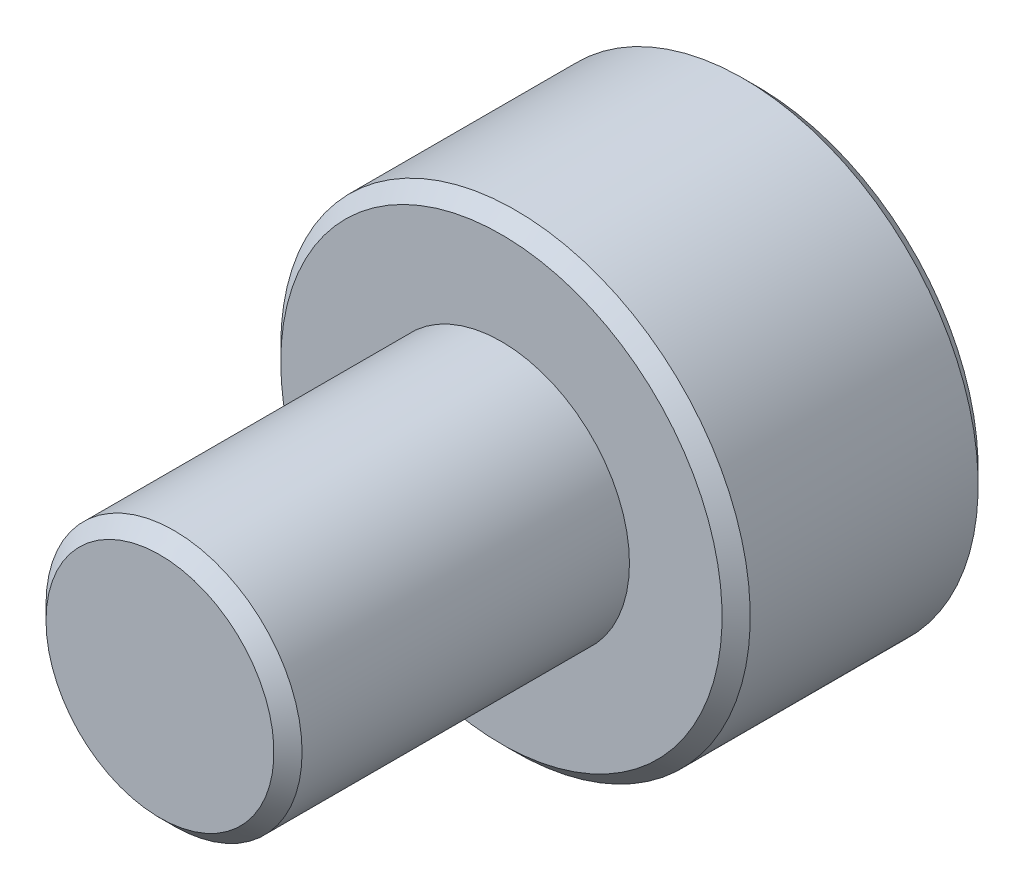
ISO-10303-21;
HEADER;
FILE_DESCRIPTION(('STEP AP214'),'2;1');
FILE_NAME('part.step','',(''),(''),'','','');
FILE_SCHEMA(('AUTOMOTIVE_DESIGN { 1 0 10303 214 1 1 1 1 }'));
ENDSEC;
DATA;
#1=APPLICATION_CONTEXT('core data for automotive mechanical design processes');
#2=APPLICATION_PROTOCOL_DEFINITION('international standard','automotive_design',2000,#1);
#3=PRODUCT_CONTEXT('',#1,'mechanical');
#4=PRODUCT('Part','Part','',(#3));
#5=PRODUCT_RELATED_PRODUCT_CATEGORY('part','',(#4));
#6=PRODUCT_DEFINITION_FORMATION('','',#4);
#7=PRODUCT_DEFINITION_CONTEXT('part definition',#1,'design');
#8=PRODUCT_DEFINITION('design','',#6,#7);
#9=PRODUCT_DEFINITION_SHAPE('','',#8);
#10=(LENGTH_UNIT() NAMED_UNIT(*) SI_UNIT(.MILLI.,.METRE.));
#11=(NAMED_UNIT(*) PLANE_ANGLE_UNIT() SI_UNIT($,.RADIAN.));
#12=(NAMED_UNIT(*) SI_UNIT($,.STERADIAN.) SOLID_ANGLE_UNIT());
#13=UNCERTAINTY_MEASURE_WITH_UNIT(LENGTH_MEASURE(1.E-05),#10,'distance_accuracy_value','');
#14=(GEOMETRIC_REPRESENTATION_CONTEXT(3) GLOBAL_UNCERTAINTY_ASSIGNED_CONTEXT((#13)) GLOBAL_UNIT_ASSIGNED_CONTEXT((#10,
#11,#12)) REPRESENTATION_CONTEXT('',''));
#15=CARTESIAN_POINT('',(0.,0.,0.));
#16=DIRECTION('',(0.,0.,1.));
#17=DIRECTION('',(1.,0.,0.));
#18=AXIS2_PLACEMENT_3D('',#15,#16,#17);
#19=CARTESIAN_POINT('',(0.,0.,-4.));
#20=DIRECTION('',(0.,0.,1.));
#21=DIRECTION('',(1.,0.,0.));
#22=AXIS2_PLACEMENT_3D('',#19,#20,#21);
#23=CYLINDRICAL_SURFACE('',#22,1.5);
#24=CARTESIAN_POINT('',(0.,0.,-0.165));
#25=DIRECTION('',(0.,0.,1.));
#26=DIRECTION('',(1.,0.,0.));
#27=AXIS2_PLACEMENT_3D('',#24,#25,#26);
#28=CIRCLE('',#27,1.5);
#29=CARTESIAN_POINT('',(-1.5,0.,-0.165));
#30=VERTEX_POINT('',#29);
#31=EDGE_CURVE('E170',#30,#30,#28,.F.);
#32=ORIENTED_EDGE('',*,*,#31,.T.);
#33=EDGE_LOOP('',(#32));
#34=FACE_BOUND('',#33,.T.);
#35=CARTESIAN_POINT('',(0.,0.,-4.));
#36=DIRECTION('',(0.,0.,-1.));
#37=DIRECTION('',(-1.,0.,0.));
#38=AXIS2_PLACEMENT_3D('',#35,#36,#37);
#39=CIRCLE('',#38,1.5);
#40=CARTESIAN_POINT('',(-1.5,0.,-4.));
#41=VERTEX_POINT('',#40);
#42=EDGE_CURVE('E111',#41,#41,#39,.F.);
#43=ORIENTED_EDGE('',*,*,#42,.T.);
#44=EDGE_LOOP('',(#43));
#45=FACE_BOUND('',#44,.T.);
#46=ADVANCED_FACE('F37',(#34,#45),#23,.T.);
#47=CARTESIAN_POINT('',(0.,0.,0.));
#48=DIRECTION('',(0.,0.,1.));
#49=DIRECTION('',(1.,0.,0.));
#50=AXIS2_PLACEMENT_3D('',#47,#48,#49);
#51=PLANE('',#50);
#52=CARTESIAN_POINT('',(0.,0.,0.));
#53=DIRECTION('',(0.,0.,1.));
#54=DIRECTION('',(1.,0.,0.));
#55=AXIS2_PLACEMENT_3D('',#52,#53,#54);
#56=CIRCLE('',#55,1.335);
#57=CARTESIAN_POINT('',(-1.335,0.,0.));
#58=VERTEX_POINT('',#57);
#59=EDGE_CURVE('E110',#58,#58,#56,.T.);
#60=ORIENTED_EDGE('',*,*,#59,.T.);
#61=EDGE_LOOP('',(#60));
#62=FACE_BOUND('',#61,.T.);
#63=ADVANCED_FACE('F198',(#62),#51,.T.);
#64=CARTESIAN_POINT('',(0.,0.,-7.));
#65=DIRECTION('',(0.,0.,1.));
#66=DIRECTION('',(1.,0.,0.));
#67=AXIS2_PLACEMENT_3D('',#64,#65,#66);
#68=CYLINDRICAL_SURFACE('',#67,2.75);
#69=CARTESIAN_POINT('',(0.,0.,-6.835));
#70=DIRECTION('',(0.,0.,-1.));
#71=DIRECTION('',(-1.,0.,0.));
#72=AXIS2_PLACEMENT_3D('',#69,#70,#71);
#73=CIRCLE('',#72,2.75);
#74=CARTESIAN_POINT('',(-2.75,0.,-6.835));
#75=VERTEX_POINT('',#74);
#76=EDGE_CURVE('E45',#75,#75,#73,.F.);
#77=ORIENTED_EDGE('',*,*,#76,.T.);
#78=EDGE_LOOP('',(#77));
#79=FACE_BOUND('',#78,.T.);
#80=CARTESIAN_POINT('',(0.,0.,-4.165));
#81=DIRECTION('',(0.,0.,-1.));
#82=DIRECTION('',(-1.,0.,0.));
#83=AXIS2_PLACEMENT_3D('',#80,#81,#82);
#84=CIRCLE('',#83,2.75);
#85=CARTESIAN_POINT('',(-2.75,0.,-4.165));
#86=VERTEX_POINT('',#85);
#87=EDGE_CURVE('E176',#86,#86,#84,.T.);
#88=ORIENTED_EDGE('',*,*,#87,.T.);
#89=EDGE_LOOP('',(#88));
#90=FACE_BOUND('',#89,.T.);
#91=ADVANCED_FACE('F181',(#79,#90),#68,.T.);
#92=CARTESIAN_POINT('',(0.,0.,-7.));
#93=DIRECTION('',(0.,0.,-1.));
#94=DIRECTION('',(-1.,0.,0.));
#95=AXIS2_PLACEMENT_3D('',#92,#93,#94);
#96=PLANE('',#95);
#97=CARTESIAN_POINT('',(0.,0.,-7.));
#98=DIRECTION('',(0.,0.,-1.));
#99=DIRECTION('',(-1.,0.,0.));
#100=AXIS2_PLACEMENT_3D('',#97,#98,#99);
#101=CIRCLE('',#100,2.585);
#102=CARTESIAN_POINT('',(-2.585,0.,-7.));
#103=VERTEX_POINT('',#102);
#104=EDGE_CURVE('E173',#103,#103,#101,.T.);
#105=ORIENTED_EDGE('',*,*,#104,.T.);
#106=EDGE_LOOP('',(#105));
#107=FACE_BOUND('',#106,.T.);
#108=CARTESIAN_POINT('',(0.,0.,-7.));
#109=DIRECTION('',(0.,0.,-1.));
#110=DIRECTION('',(-1.,0.,0.));
#111=AXIS2_PLACEMENT_3D('',#108,#109,#110);
#112=CIRCLE('',#111,1.44337567297406);
#113=CARTESIAN_POINT('',(-1.25,0.721687836487032,-7.));
#114=VERTEX_POINT('',#113);
#115=CARTESIAN_POINT('',(0.,1.44337567297407,-7.));
#116=VERTEX_POINT('',#115);
#117=EDGE_CURVE('E91',#114,#116,#112,.T.);
#118=ORIENTED_EDGE('',*,*,#117,.F.);
#119=CARTESIAN_POINT('',(-1.25,-0.721687836487032,-7.));
#120=VERTEX_POINT('',#119);
#121=EDGE_CURVE('E51',#120,#114,#112,.T.);
#122=ORIENTED_EDGE('',*,*,#121,.F.);
#123=CARTESIAN_POINT('',(0.,-1.44337567297406,-7.));
#124=VERTEX_POINT('',#123);
#125=EDGE_CURVE('E275',#124,#120,#112,.T.);
#126=ORIENTED_EDGE('',*,*,#125,.F.);
#127=CARTESIAN_POINT('',(1.25,-0.721687836487032,-7.));
#128=VERTEX_POINT('',#127);
#129=EDGE_CURVE('E58',#128,#124,#112,.T.);
#130=ORIENTED_EDGE('',*,*,#129,.F.);
#131=CARTESIAN_POINT('',(1.25,0.721687836487033,-7.));
#132=VERTEX_POINT('',#131);
#133=EDGE_CURVE('E132',#132,#128,#112,.T.);
#134=ORIENTED_EDGE('',*,*,#133,.F.);
#135=EDGE_CURVE('E100',#116,#132,#112,.T.);
#136=ORIENTED_EDGE('',*,*,#135,.F.);
#137=EDGE_LOOP('',(#118,#122,#126,#130,#134,#136));
#138=FACE_BOUND('',#137,.T.);
#139=ADVANCED_FACE('F131',(#107,#138),#96,.T.);
#140=CARTESIAN_POINT('',(0.,0.,-4.));
#141=DIRECTION('',(0.,0.,-1.));
#142=DIRECTION('',(-1.,0.,0.));
#143=AXIS2_PLACEMENT_3D('',#140,#141,#142);
#144=PLANE('',#143);
#145=CARTESIAN_POINT('',(0.,0.,-4.));
#146=DIRECTION('',(0.,0.,-1.));
#147=DIRECTION('',(-1.,0.,0.));
#148=AXIS2_PLACEMENT_3D('',#145,#146,#147);
#149=CIRCLE('',#148,2.585);
#150=CARTESIAN_POINT('',(-2.585,0.,-4.));
#151=VERTEX_POINT('',#150);
#152=EDGE_CURVE('E11',#151,#151,#149,.F.);
#153=ORIENTED_EDGE('',*,*,#152,.T.);
#154=EDGE_LOOP('',(#153));
#155=FACE_BOUND('',#154,.T.);
#156=ORIENTED_EDGE('',*,*,#42,.F.);
#157=EDGE_LOOP('',(#156));
#158=FACE_BOUND('',#157,.T.);
#159=ADVANCED_FACE('F191',(#155,#158),#144,.F.);
#160=CARTESIAN_POINT('',(0.,0.,-7.));
#161=DIRECTION('',(0.,0.,-1.));
#162=DIRECTION('',(-1.,0.,0.));
#163=AXIS2_PLACEMENT_3D('',#160,#161,#162);
#164=CONICAL_SURFACE('',#163,1.44337567297406,0.78539816339745);
#165=ORIENTED_EDGE('',*,*,#135,.T.);
#166=CARTESIAN_POINT('',(-0.000200000000000073,1.4434911430279,-7.00011548390914));
#167=CARTESIAN_POINT('',(0.0427751670715866,1.41867941875065,-6.9753216680551));
#168=CARTESIAN_POINT('',(0.086469004745948,1.39345276980743,-6.95198373441868));
#169=CARTESIAN_POINT('',(0.175565930841942,1.34201263554194,-6.90925200408454));
#170=CARTESIAN_POINT('',(0.220977498357064,1.31579425481276,-6.88988199236041));
#171=CARTESIAN_POINT('',(0.31254782093526,1.26292610442246,-6.85670048341348));
#172=CARTESIAN_POINT('',(0.358683240175886,1.23628980770471,-6.84280555905266));
#173=CARTESIAN_POINT('',(0.451970080407593,1.18243062538508,-6.82139728216064));
#174=CARTESIAN_POINT('',(0.49911864913638,1.15520938653761,-6.81386794156679));
#175=CARTESIAN_POINT('',(0.580373556887253,1.10829684367467,-6.8070744980507));
#176=CARTESIAN_POINT('',(0.614374876627942,1.08866617256958,-6.80606855910435));
#177=CARTESIAN_POINT('',(0.682317764432478,1.04943932800611,-6.80776141491132));
#178=CARTESIAN_POINT('',(0.716259317655658,1.02984316311599,-6.81046102721554));
#179=CARTESIAN_POINT('',(0.7838148564575,0.990839954603499,-6.81940893031638));
#180=CARTESIAN_POINT('',(0.817428507286775,0.971433104248771,-6.82566052589971));
#181=CARTESIAN_POINT('',(0.884094638217814,0.932943395609905,-6.84137568141391));
#182=CARTESIAN_POINT('',(0.917146871030296,0.9138606800983,-6.85084062008746));
#183=CARTESIAN_POINT('',(1.00179969160026,0.864986351354567,-6.87893139068759));
#184=CARTESIAN_POINT('',(1.05286649242964,0.835502920149076,-6.8996701574522));
#185=CARTESIAN_POINT('',(1.15300085411326,0.777690319475908,-6.94638713467148));
#186=CARTESIAN_POINT('',(1.20207431157827,0.749357745598416,-6.97234829594677));
#187=CARTESIAN_POINT('',(1.2502,0.721572366433194,-7.00011548390914));
#188=B_SPLINE_CURVE_WITH_KNOTS('',3,(#166,#167,#168,#169,#170,#171,#172,#173,#174,#175,#176,
#177,#178,#179,#180,#181,#182,#183,#184,#185,#186,#187),.UNSPECIFIED.,.F.,.F.,(4,2,2,2,2,2,2,2,
2,2,4),(0.,0.166533409618304,0.334037607289762,0.498880396489699,0.663307919240275,
0.780963963458828,0.898645970148454,1.01643764860773,1.1342799317155,1.32148652032141,
1.50809158792574),.UNSPECIFIED.);
#189=EDGE_CURVE('E105',#116,#132,#188,.T.);
#190=ORIENTED_EDGE('',*,*,#189,.F.);
#191=EDGE_LOOP('',(#165,#190));
#192=FACE_BOUND('',#191,.T.);
#193=ADVANCED_FACE('F106',(#192),#164,.F.);
#194=ORIENTED_EDGE('',*,*,#133,.T.);
#195=CARTESIAN_POINT('',(1.25,-1.43934010808077,-7.46298209689233));
#196=CARTESIAN_POINT('',(1.25,-1.40429313005659,-7.43652492263289));
#197=CARTESIAN_POINT('',(1.25,-1.36905087135599,-7.41032716035428));
#198=CARTESIAN_POINT('',(1.25,-1.29809650706311,-7.35855757183958));
#199=CARTESIAN_POINT('',(1.25,-1.26238428576495,-7.33298590435629));
#200=CARTESIAN_POINT('',(1.25,-1.15390111792708,-7.25700599368946));
#201=CARTESIAN_POINT('',(1.25,-1.08031646726264,-7.20774028618957));
#202=CARTESIAN_POINT('',(1.25,-0.926012322755096,-7.11102583026313));
#203=CARTESIAN_POINT('',(1.25,-0.845125318656148,-7.0638412989418));
#204=CARTESIAN_POINT('',(1.25,-0.679311174076603,-6.97753073439041));
#205=CARTESIAN_POINT('',(1.25,-0.594398891026688,-6.9383775346269));
#206=CARTESIAN_POINT('',(1.25,-0.46694481246074,-6.89047722368829));
#207=CARTESIAN_POINT('',(1.25,-0.426289985812822,-6.87672948978634));
#208=CARTESIAN_POINT('',(1.25,-0.343998850091267,-6.85249792745054));
#209=CARTESIAN_POINT('',(1.25,-0.302362473614962,-6.84201432386977));
#210=CARTESIAN_POINT('',(1.25,-0.219052696285665,-6.8250301617483));
#211=CARTESIAN_POINT('',(1.25,-0.1773934284745,-6.81846136047137));
#212=CARTESIAN_POINT('',(1.25,-0.0936293693401918,-6.80943505345776));
#213=CARTESIAN_POINT('',(1.25,-0.0515246558543955,-6.80697684099727));
#214=CARTESIAN_POINT('',(1.25,0.0311890576306321,-6.80635406201328));
#215=CARTESIAN_POINT('',(1.25,0.0717969625499308,-6.80803711684625));
#216=CARTESIAN_POINT('',(1.25,0.152668636885198,-6.81526827059791));
#217=CARTESIAN_POINT('',(1.25,0.192932338835358,-6.82081711041311));
#218=CARTESIAN_POINT('',(1.25,0.273499879165295,-6.83557103646495));
#219=CARTESIAN_POINT('',(1.25,0.313792180618511,-6.8448381759641));
#220=CARTESIAN_POINT('',(1.25,0.393496413911457,-6.86653617845735));
#221=CARTESIAN_POINT('',(1.25,0.432908419115059,-6.87896677673065));
#222=CARTESIAN_POINT('',(1.25,0.556992735862299,-6.92277935293144));
#223=CARTESIAN_POINT('',(1.25,0.639898924666086,-6.95915107287596));
#224=CARTESIAN_POINT('',(1.25,0.801816555499702,-7.04001916217834));
#225=CARTESIAN_POINT('',(1.25,0.880812666325046,-7.08454472091199));
#226=CARTESIAN_POINT('',(1.25,1.0317856127975,-7.17640487666663));
#227=CARTESIAN_POINT('',(1.25,1.10391618485086,-7.22348993391625));
#228=CARTESIAN_POINT('',(1.25,1.21018606043311,-7.29627856159854));
#229=CARTESIAN_POINT('',(1.25,1.2451506996938,-7.32079808539336));
#230=CARTESIAN_POINT('',(1.25,1.31460220852737,-7.37048563676568));
#231=CARTESIAN_POINT('',(1.25,1.34908920596618,-7.39565348541552));
#232=CARTESIAN_POINT('',(1.25,1.38337731682912,-7.42109014884121));
#233=B_SPLINE_CURVE_WITH_KNOTS('',3,(#195,#196,#197,#198,#199,#200,#201,#202,#203,#204,#205,
#206,#207,#208,#209,#210,#211,#212,#213,#214,#215,#216,#217,#218,#219,#220,#221,#222,#223,#224,
#225,#226,#227,#228,#229,#230,#231,#232),.UNSPECIFIED.,.F.,.F.,(4,2,2,2,2,2,2,2,2,2,2,2,2,2,2,2,
2,2,4),(0.,0.131732960381448,0.263498984161644,0.529042014455825,0.809741926134618,
1.08947609717225,1.21811634272577,1.34676544783901,1.47310084517844,1.59941451973785,
1.7211504216785,1.84290966131735,1.96679153905342,2.09066305366039,2.36146692896009,
2.63325989198491,2.89154668212279,3.01965734507713,3.14773302245628),.UNSPECIFIED.);
#234=EDGE_CURVE('E99',#132,#128,#233,.F.);
#235=ORIENTED_EDGE('',*,*,#234,.F.);
#236=EDGE_LOOP('',(#194,#235));
#237=FACE_BOUND('',#236,.T.);
#238=ADVANCED_FACE('F281',(#237),#164,.F.);
#239=ORIENTED_EDGE('',*,*,#129,.T.);
#240=CARTESIAN_POINT('',(1.2502,-0.721572366433195,-7.00011548390914));
#241=CARTESIAN_POINT('',(1.20722483292841,-0.746384090710445,-6.9753216680551));
#242=CARTESIAN_POINT('',(1.16353099525405,-0.771610739653665,-6.95198373441868));
#243=CARTESIAN_POINT('',(1.07443406915806,-0.823050873919155,-6.90925200408454));
#244=CARTESIAN_POINT('',(1.02902250164294,-0.849269254648334,-6.88988199236041));
#245=CARTESIAN_POINT('',(0.93745217906474,-0.902137405038636,-6.85670048341348));
#246=CARTESIAN_POINT('',(0.891316759824114,-0.928773701756388,-6.84280555905266));
#247=CARTESIAN_POINT('',(0.798029919592407,-0.982632884076013,-6.82139728216064));
#248=CARTESIAN_POINT('',(0.75088135086362,-1.00985412292348,-6.81386794156679));
#249=CARTESIAN_POINT('',(0.669626443112747,-1.05676666578643,-6.8070744980507));
#250=CARTESIAN_POINT('',(0.635625123372059,-1.07639733689152,-6.80606855910435));
#251=CARTESIAN_POINT('',(0.567682235567522,-1.11562418145499,-6.80776141491132));
#252=CARTESIAN_POINT('',(0.533740682344342,-1.1352203463451,-6.81046102721554));
#253=CARTESIAN_POINT('',(0.4661851435425,-1.1742235548576,-6.81940893031638));
#254=CARTESIAN_POINT('',(0.432571492713225,-1.19363040521233,-6.82566052589971));
#255=CARTESIAN_POINT('',(0.365905361782187,-1.23212011385119,-6.84137568141391));
#256=CARTESIAN_POINT('',(0.332853128969704,-1.2512028293628,-6.85084062008746));
#257=CARTESIAN_POINT('',(0.248200308399735,-1.30007715810653,-6.87893139068759));
#258=CARTESIAN_POINT('',(0.197133507570361,-1.32956058931202,-6.8996701574522));
#259=CARTESIAN_POINT('',(0.0969991458867447,-1.38737318998519,-6.94638713467148));
#260=CARTESIAN_POINT('',(0.0479256884217303,-1.41570576386268,-6.97234829594677));
#261=CARTESIAN_POINT('',(-0.000199999999999965,-1.4434911430279,-7.00011548390914));
#262=B_SPLINE_CURVE_WITH_KNOTS('',3,(#240,#241,#242,#243,#244,#245,#246,#247,#248,#249,#250,
#251,#252,#253,#254,#255,#256,#257,#258,#259,#260,#261),.UNSPECIFIED.,.F.,.F.,(4,2,2,2,2,2,2,2,
2,2,4),(0.,0.166533409618304,0.334037607289762,0.498880396489699,0.663307919240275,
0.780963963458827,0.898645970148453,1.01643764860773,1.1342799317155,1.32148652032141,
1.50809158792574),.UNSPECIFIED.);
#263=EDGE_CURVE('E141',#128,#124,#262,.T.);
#264=ORIENTED_EDGE('',*,*,#263,.F.);
#265=EDGE_LOOP('',(#239,#264));
#266=FACE_BOUND('',#265,.T.);
#267=ADVANCED_FACE('F279',(#266),#164,.F.);
#268=ORIENTED_EDGE('',*,*,#125,.T.);
#269=CARTESIAN_POINT('',(0.000200000000000079,-1.4434911430279,-7.00011548390914));
#270=CARTESIAN_POINT('',(-0.0427751670715866,-1.41867941875065,-6.9753216680551));
#271=CARTESIAN_POINT('',(-0.086469004745948,-1.39345276980743,-6.95198373441868));
#272=CARTESIAN_POINT('',(-0.175565930841942,-1.34201263554194,-6.90925200408454));
#273=CARTESIAN_POINT('',(-0.220977498357064,-1.31579425481276,-6.88988199236041));
#274=CARTESIAN_POINT('',(-0.31254782093526,-1.26292610442246,-6.85670048341348));
#275=CARTESIAN_POINT('',(-0.358683240175886,-1.23628980770471,-6.84280555905266));
#276=CARTESIAN_POINT('',(-0.451970080407592,-1.18243062538508,-6.82139728216064));
#277=CARTESIAN_POINT('',(-0.49911864913638,-1.15520938653761,-6.81386794156679));
#278=CARTESIAN_POINT('',(-0.580373556887252,-1.10829684367467,-6.8070744980507));
#279=CARTESIAN_POINT('',(-0.614374876627941,-1.08866617256958,-6.80606855910435));
#280=CARTESIAN_POINT('',(-0.682317764432477,-1.04943932800611,-6.80776141491132));
#281=CARTESIAN_POINT('',(-0.716259317655657,-1.02984316311599,-6.81046102721554));
#282=CARTESIAN_POINT('',(-0.783814856457499,-0.9908399546035,-6.81940893031638));
#283=CARTESIAN_POINT('',(-0.817428507286775,-0.971433104248772,-6.82566052589971));
#284=CARTESIAN_POINT('',(-0.884094638217813,-0.932943395609906,-6.8413756814139));
#285=CARTESIAN_POINT('',(-0.917146871030295,-0.913860680098301,-6.85084062008746));
#286=CARTESIAN_POINT('',(-1.00179969160026,-0.864986351354568,-6.87893139068759));
#287=CARTESIAN_POINT('',(-1.05286649242964,-0.835502920149076,-6.8996701574522));
#288=CARTESIAN_POINT('',(-1.15300085411326,-0.777690319475909,-6.94638713467148));
#289=CARTESIAN_POINT('',(-1.20207431157827,-0.749357745598417,-6.97234829594677));
#290=CARTESIAN_POINT('',(-1.2502,-0.721572366433195,-7.00011548390914));
#291=B_SPLINE_CURVE_WITH_KNOTS('',3,(#269,#270,#271,#272,#273,#274,#275,#276,#277,#278,#279,
#280,#281,#282,#283,#284,#285,#286,#287,#288,#289,#290),.UNSPECIFIED.,.F.,.F.,(4,2,2,2,2,2,2,2,
2,2,4),(0.,0.166533409618304,0.334037607289762,0.498880396489698,0.663307919240274,
0.780963963458827,0.898645970148453,1.01643764860773,1.13427993171549,1.32148652032141,
1.50809158792574),.UNSPECIFIED.);
#292=EDGE_CURVE('E235',#124,#120,#291,.T.);
#293=ORIENTED_EDGE('',*,*,#292,.F.);
#294=EDGE_LOOP('',(#268,#293));
#295=FACE_BOUND('',#294,.T.);
#296=ADVANCED_FACE('F276',(#295),#164,.F.);
#297=ORIENTED_EDGE('',*,*,#121,.T.);
#298=CARTESIAN_POINT('',(-1.25,-1.43934010829019,-7.46298209705044));
#299=CARTESIAN_POINT('',(-1.25,-1.40429313026013,-7.43652492278491));
#300=CARTESIAN_POINT('',(-1.25,-1.36905087155364,-7.41032716050022));
#301=CARTESIAN_POINT('',(-1.25,-1.29809650724891,-7.3585575719734));
#302=CARTESIAN_POINT('',(-1.25,-1.2623842859448,-7.33298590448407));
#303=CARTESIAN_POINT('',(-1.25,-1.1539011180887,-7.25700599379899));
#304=CARTESIAN_POINT('',(-1.25,-1.08031646741187,-7.20774028628697));
#305=CARTESIAN_POINT('',(-1.25,-0.926012322877302,-7.11102583033562));
#306=CARTESIAN_POINT('',(-1.25,-0.845125318763648,-7.06384129900157));
#307=CARTESIAN_POINT('',(-1.25,-0.679311174153443,-6.97753073442662));
#308=CARTESIAN_POINT('',(-1.25,-0.594398891087583,-6.93837753465223));
#309=CARTESIAN_POINT('',(-1.25,-0.466944812509639,-6.89047722370555));
#310=CARTESIAN_POINT('',(-1.25,-0.426289985866744,-6.87672948980391));
#311=CARTESIAN_POINT('',(-1.25,-0.343998850155403,-6.85249792746773));
#312=CARTESIAN_POINT('',(-1.25,-0.302362473684286,-6.84201432388626));
#313=CARTESIAN_POINT('',(-1.25,-0.219052696365195,-6.8250301617622));
#314=CARTESIAN_POINT('',(-1.25,-0.177393428559044,-6.81846136048343));
#315=CARTESIAN_POINT('',(-1.25,-0.0936293694345982,-6.80943505346499));
#316=CARTESIAN_POINT('',(-1.25,-0.051524655953649,-6.80697684100152));
#317=CARTESIAN_POINT('',(-1.25,0.0311890575224387,-6.80635406201073));
#318=CARTESIAN_POINT('',(-1.25,0.071796962437632,-6.80803711683992));
#319=CARTESIAN_POINT('',(-1.25,0.152668636765093,-6.81526827058346));
#320=CARTESIAN_POINT('',(-1.25,0.192932338711554,-6.8208171103943));
#321=CARTESIAN_POINT('',(-1.25,0.273499879034189,-6.83557103643701));
#322=CARTESIAN_POINT('',(-1.25,0.313792180483814,-6.84483817593136));
#323=CARTESIAN_POINT('',(-1.25,0.393496413769926,-6.86653617841489));
#324=CARTESIAN_POINT('',(-1.25,0.432908418970283,-6.87896677668328));
#325=CARTESIAN_POINT('',(-1.25,0.556992735685998,-6.92277935286094));
#326=CARTESIAN_POINT('',(-1.25,0.639898924463084,-6.95915107278417));
#327=CARTESIAN_POINT('',(-1.25,0.801816555245349,-7.04001916204164));
#328=CARTESIAN_POINT('',(-1.25,0.880812666046053,-7.08454472075164));
#329=CARTESIAN_POINT('',(-1.25,1.03178561247421,-7.17640487646102));
#330=CARTESIAN_POINT('',(-1.25,1.10391618450775,-7.22348993368924));
#331=CARTESIAN_POINT('',(-1.25,1.2101860600607,-7.29627856133952));
#332=CARTESIAN_POINT('',(-1.25,1.24515069931176,-7.32079808512376));
#333=CARTESIAN_POINT('',(-1.25,1.31460220812614,-7.37048563647493));
#334=CARTESIAN_POINT('',(-1.25,1.3490892055554,-7.3956534851142));
#335=CARTESIAN_POINT('',(-1.25,1.38337731640879,-7.42109014852934));
#336=B_SPLINE_CURVE_WITH_KNOTS('',3,(#298,#299,#300,#301,#302,#303,#304,#305,#306,#307,#308,
#309,#310,#311,#312,#313,#314,#315,#316,#317,#318,#319,#320,#321,#322,#323,#324,#325,#326,#327,
#328,#329,#330,#331,#332,#333,#334,#335),.UNSPECIFIED.,.F.,.F.,(4,2,2,2,2,2,2,2,2,2,2,2,2,2,2,2,
2,2,4),(0.,0.131732960406523,0.263498984211801,0.529042014557082,0.809741926293179,
1.08947609738757,1.21811634292656,1.34676544802529,1.47310084535082,1.59941451989631,
1.72115042182424,1.84290966145034,1.96679153917269,2.09066305376595,2.36146692896707,
2.63325989189267,2.89154668194565,3.01965734485811,3.1477330221954),.UNSPECIFIED.);
#337=EDGE_CURVE('E121',#120,#114,#336,.T.);
#338=ORIENTED_EDGE('',*,*,#337,.F.);
#339=EDGE_LOOP('',(#297,#338));
#340=FACE_BOUND('',#339,.T.);
#341=ADVANCED_FACE('F272',(#340),#164,.F.);
#342=ORIENTED_EDGE('',*,*,#117,.T.);
#343=CARTESIAN_POINT('',(-1.2502,0.721572366433195,-7.00011548390914));
#344=CARTESIAN_POINT('',(-1.20722483292841,0.746384090710444,-6.9753216680551));
#345=CARTESIAN_POINT('',(-1.16353099525405,0.771610739653664,-6.95198373441868));
#346=CARTESIAN_POINT('',(-1.07443406915806,0.823050873919155,-6.90925200408454));
#347=CARTESIAN_POINT('',(-1.02902250164294,0.849269254648334,-6.88988199236042));
#348=CARTESIAN_POINT('',(-0.93745217906474,0.902137405038636,-6.85670048341348));
#349=CARTESIAN_POINT('',(-0.891316759824115,0.928773701756388,-6.84280555905266));
#350=CARTESIAN_POINT('',(-0.798029919592408,0.982632884076013,-6.82139728216064));
#351=CARTESIAN_POINT('',(-0.75088135086362,1.00985412292348,-6.81386794156679));
#352=CARTESIAN_POINT('',(-0.669626443112747,1.05676666578643,-6.8070744980507));
#353=CARTESIAN_POINT('',(-0.635625123372059,1.07639733689152,-6.80606855910435));
#354=CARTESIAN_POINT('',(-0.567682235567522,1.11562418145499,-6.80776141491132));
#355=CARTESIAN_POINT('',(-0.533740682344342,1.1352203463451,-6.81046102721554));
#356=CARTESIAN_POINT('',(-0.4661851435425,1.1742235548576,-6.81940893031638));
#357=CARTESIAN_POINT('',(-0.432571492713225,1.19363040521233,-6.82566052589971));
#358=CARTESIAN_POINT('',(-0.365905361782186,1.23212011385119,-6.84137568141391));
#359=CARTESIAN_POINT('',(-0.332853128969704,1.2512028293628,-6.85084062008746));
#360=CARTESIAN_POINT('',(-0.248200308399735,1.30007715810653,-6.87893139068759));
#361=CARTESIAN_POINT('',(-0.197133507570361,1.32956058931202,-6.8996701574522));
#362=CARTESIAN_POINT('',(-0.0969991458867449,1.38737318998519,-6.94638713467148));
#363=CARTESIAN_POINT('',(-0.0479256884217304,1.41570576386268,-6.97234829594677));
#364=CARTESIAN_POINT('',(0.000200000000000037,1.4434911430279,-7.00011548390914));
#365=B_SPLINE_CURVE_WITH_KNOTS('',3,(#343,#344,#345,#346,#347,#348,#349,#350,#351,#352,#353,
#354,#355,#356,#357,#358,#359,#360,#361,#362,#363,#364),.UNSPECIFIED.,.F.,.F.,(4,2,2,2,2,2,2,2,
2,2,4),(0.,0.166533409618304,0.334037607289762,0.498880396489699,0.663307919240275,
0.780963963458828,0.898645970148454,1.01643764860773,1.1342799317155,1.32148652032141,
1.50809158792574),.UNSPECIFIED.);
#366=EDGE_CURVE('E95',#114,#116,#365,.T.);
#367=ORIENTED_EDGE('',*,*,#366,.F.);
#368=EDGE_LOOP('',(#342,#367));
#369=FACE_BOUND('',#368,.T.);
#370=ADVANCED_FACE('F93',(#369),#164,.F.);
#371=CARTESIAN_POINT('',(1.25,2.1650635094611,-5.125));
#372=DIRECTION('',(0.,0.,-1.));
#373=DIRECTION('',(-1.,0.,0.));
#374=AXIS2_PLACEMENT_3D('',#371,#372,#373);
#375=PLANE('',#374);
#376=DIRECTION('',(0.866025403784439,0.5,0.));
#377=VECTOR('',#376,1.);
#378=CARTESIAN_POINT('',(-1.25,0.721687836487032,-5.125));
#379=LINE('',#378,#377);
#380=CARTESIAN_POINT('',(-1.25,0.721687836487032,-5.125));
#381=VERTEX_POINT('',#380);
#382=CARTESIAN_POINT('',(0.,1.44337567297406,-5.125));
#383=VERTEX_POINT('',#382);
#384=EDGE_CURVE('E120',#381,#383,#379,.T.);
#385=ORIENTED_EDGE('',*,*,#384,.T.);
#386=DIRECTION('',(0.866025403784439,-0.5,0.));
#387=VECTOR('',#386,1.);
#388=CARTESIAN_POINT('',(0.,1.44337567297406,-5.125));
#389=LINE('',#388,#387);
#390=CARTESIAN_POINT('',(1.25,0.721687836487032,-5.125));
#391=VERTEX_POINT('',#390);
#392=EDGE_CURVE('E125',#383,#391,#389,.T.);
#393=ORIENTED_EDGE('',*,*,#392,.T.);
#394=DIRECTION('',(0.,-1.,0.));
#395=VECTOR('',#394,1.);
#396=CARTESIAN_POINT('',(1.25,0.721687836487032,-5.125));
#397=LINE('',#396,#395);
#398=CARTESIAN_POINT('',(1.25,-0.721687836487033,-5.125));
#399=VERTEX_POINT('',#398);
#400=EDGE_CURVE('E245',#391,#399,#397,.T.);
#401=ORIENTED_EDGE('',*,*,#400,.T.);
#402=DIRECTION('',(-0.866025403784439,-0.5,0.));
#403=VECTOR('',#402,1.);
#404=CARTESIAN_POINT('',(1.25,-0.721687836487033,-5.125));
#405=LINE('',#404,#403);
#406=CARTESIAN_POINT('',(0.,-1.44337567297406,-5.125));
#407=VERTEX_POINT('',#406);
#408=EDGE_CURVE('E248',#399,#407,#405,.T.);
#409=ORIENTED_EDGE('',*,*,#408,.T.);
#410=DIRECTION('',(-0.866025403784439,0.5,0.));
#411=VECTOR('',#410,1.);
#412=CARTESIAN_POINT('',(0.,-1.44337567297406,-5.125));
#413=LINE('',#412,#411);
#414=CARTESIAN_POINT('',(-1.25,-0.721687836487032,-5.125));
#415=VERTEX_POINT('',#414);
#416=EDGE_CURVE('E251',#407,#415,#413,.T.);
#417=ORIENTED_EDGE('',*,*,#416,.T.);
#418=DIRECTION('',(0.,1.,0.));
#419=VECTOR('',#418,1.);
#420=CARTESIAN_POINT('',(-1.25,-0.721687836487032,-5.125));
#421=LINE('',#420,#419);
#422=EDGE_CURVE('E128',#415,#381,#421,.T.);
#423=ORIENTED_EDGE('',*,*,#422,.T.);
#424=EDGE_LOOP('',(#385,#393,#401,#409,#417,#423));
#425=FACE_BOUND('',#424,.T.);
#426=ADVANCED_FACE('F160',(#425),#375,.T.);
#427=CARTESIAN_POINT('',(0.,1.44337567297406,-5.125));
#428=DIRECTION('',(0.5,0.866025403784439,0.));
#429=DIRECTION('',(-0.866025403784439,0.5,0.));
#430=AXIS2_PLACEMENT_3D('',#427,#428,#429);
#431=PLANE('',#430);
#432=DIRECTION('',(0.,0.,-1.));
#433=VECTOR('',#432,1.);
#434=CARTESIAN_POINT('',(0.,1.44337567297406,-5.125));
#435=LINE('',#434,#433);
#436=EDGE_CURVE('E117',#383,#116,#435,.T.);
#437=ORIENTED_EDGE('',*,*,#436,.T.);
#438=ORIENTED_EDGE('',*,*,#189,.T.);
#439=DIRECTION('',(0.,0.,-1.));
#440=VECTOR('',#439,1.);
#441=CARTESIAN_POINT('',(1.25,0.721687836487032,-5.125));
#442=LINE('',#441,#440);
#443=EDGE_CURVE('E127',#391,#132,#442,.T.);
#444=ORIENTED_EDGE('',*,*,#443,.F.);
#445=ORIENTED_EDGE('',*,*,#392,.F.);
#446=EDGE_LOOP('',(#437,#438,#444,#445));
#447=FACE_BOUND('',#446,.T.);
#448=ADVANCED_FACE('F123',(#447),#431,.F.);
#449=CARTESIAN_POINT('',(1.25,0.721687836487032,-5.125));
#450=DIRECTION('',(1.,0.,0.));
#451=DIRECTION('',(0.,0.,-1.));
#452=AXIS2_PLACEMENT_3D('',#449,#450,#451);
#453=PLANE('',#452);
#454=ORIENTED_EDGE('',*,*,#443,.T.);
#455=ORIENTED_EDGE('',*,*,#234,.T.);
#456=DIRECTION('',(0.,0.,-1.));
#457=VECTOR('',#456,1.);
#458=CARTESIAN_POINT('',(1.25,-0.721687836487033,-5.125));
#459=LINE('',#458,#457);
#460=EDGE_CURVE('E262',#399,#128,#459,.T.);
#461=ORIENTED_EDGE('',*,*,#460,.F.);
#462=ORIENTED_EDGE('',*,*,#400,.F.);
#463=EDGE_LOOP('',(#454,#455,#461,#462));
#464=FACE_BOUND('',#463,.T.);
#465=ADVANCED_FACE('F149',(#464),#453,.F.);
#466=CARTESIAN_POINT('',(1.25,-0.721687836487033,-5.125));
#467=DIRECTION('',(0.5,-0.866025403784439,0.));
#468=DIRECTION('',(0.866025403784439,0.5,0.));
#469=AXIS2_PLACEMENT_3D('',#466,#467,#468);
#470=PLANE('',#469);
#471=ORIENTED_EDGE('',*,*,#460,.T.);
#472=ORIENTED_EDGE('',*,*,#263,.T.);
#473=DIRECTION('',(0.,0.,-1.));
#474=VECTOR('',#473,1.);
#475=CARTESIAN_POINT('',(0.,-1.44337567297406,-5.125));
#476=LINE('',#475,#474);
#477=EDGE_CURVE('E259',#407,#124,#476,.T.);
#478=ORIENTED_EDGE('',*,*,#477,.F.);
#479=ORIENTED_EDGE('',*,*,#408,.F.);
#480=EDGE_LOOP('',(#471,#472,#478,#479));
#481=FACE_BOUND('',#480,.T.);
#482=ADVANCED_FACE('F153',(#481),#470,.F.);
#483=CARTESIAN_POINT('',(0.,-1.44337567297406,-5.125));
#484=DIRECTION('',(-0.5,-0.866025403784439,0.));
#485=DIRECTION('',(0.866025403784439,-0.5,0.));
#486=AXIS2_PLACEMENT_3D('',#483,#484,#485);
#487=PLANE('',#486);
#488=ORIENTED_EDGE('',*,*,#477,.T.);
#489=ORIENTED_EDGE('',*,*,#292,.T.);
#490=DIRECTION('',(0.,0.,-1.));
#491=VECTOR('',#490,1.);
#492=CARTESIAN_POINT('',(-1.25,-0.721687836487032,-5.125));
#493=LINE('',#492,#491);
#494=EDGE_CURVE('E257',#415,#120,#493,.T.);
#495=ORIENTED_EDGE('',*,*,#494,.F.);
#496=ORIENTED_EDGE('',*,*,#416,.F.);
#497=EDGE_LOOP('',(#488,#489,#495,#496));
#498=FACE_BOUND('',#497,.T.);
#499=ADVANCED_FACE('F222',(#498),#487,.F.);
#500=CARTESIAN_POINT('',(-1.25,-0.721687836487032,-5.125));
#501=DIRECTION('',(-1.,0.,0.));
#502=DIRECTION('',(0.,-1.,0.));
#503=AXIS2_PLACEMENT_3D('',#500,#501,#502);
#504=PLANE('',#503);
#505=ORIENTED_EDGE('',*,*,#494,.T.);
#506=ORIENTED_EDGE('',*,*,#337,.T.);
#507=DIRECTION('',(0.,0.,-1.));
#508=VECTOR('',#507,1.);
#509=CARTESIAN_POINT('',(-1.25,0.721687836487032,-5.125));
#510=LINE('',#509,#508);
#511=EDGE_CURVE('E119',#381,#114,#510,.T.);
#512=ORIENTED_EDGE('',*,*,#511,.F.);
#513=ORIENTED_EDGE('',*,*,#422,.F.);
#514=EDGE_LOOP('',(#505,#506,#512,#513));
#515=FACE_BOUND('',#514,.T.);
#516=ADVANCED_FACE('F215',(#515),#504,.F.);
#517=CARTESIAN_POINT('',(-1.25,0.721687836487032,-5.125));
#518=DIRECTION('',(-0.5,0.866025403784439,0.));
#519=DIRECTION('',(-0.866025403784439,-0.5,0.));
#520=AXIS2_PLACEMENT_3D('',#517,#518,#519);
#521=PLANE('',#520);
#522=ORIENTED_EDGE('',*,*,#511,.T.);
#523=ORIENTED_EDGE('',*,*,#366,.T.);
#524=ORIENTED_EDGE('',*,*,#436,.F.);
#525=ORIENTED_EDGE('',*,*,#384,.F.);
#526=EDGE_LOOP('',(#522,#523,#524,#525));
#527=FACE_BOUND('',#526,.T.);
#528=ADVANCED_FACE('F115',(#527),#521,.F.);
#529=CARTESIAN_POINT('',(0.,0.,0.));
#530=DIRECTION('',(0.,0.,-1.));
#531=DIRECTION('',(-1.,0.,0.));
#532=AXIS2_PLACEMENT_3D('',#529,#530,#531);
#533=CONICAL_SURFACE('',#532,1.335,0.785398163397444);
#534=CARTESIAN_POINT('',(-1.5,0.,-0.165));
#535=CARTESIAN_POINT('',(-1.49828125,0.,-0.16328125));
#536=CARTESIAN_POINT('',(-1.4965625,0.,-0.1615625));
#537=CARTESIAN_POINT('',(-1.493125,0.,-0.158125));
#538=CARTESIAN_POINT('',(-1.49140625,0.,-0.15640625));
#539=CARTESIAN_POINT('',(-1.48796875,0.,-0.15296875));
#540=CARTESIAN_POINT('',(-1.48625,0.,-0.15125));
#541=CARTESIAN_POINT('',(-1.4828125,0.,-0.1478125));
#542=CARTESIAN_POINT('',(-1.48109375,0.,-0.14609375));
#543=CARTESIAN_POINT('',(-1.47765625,0.,-0.14265625));
#544=CARTESIAN_POINT('',(-1.4759375,0.,-0.1409375));
#545=CARTESIAN_POINT('',(-1.4725,0.,-0.1375));
#546=CARTESIAN_POINT('',(-1.47078125,0.,-0.13578125));
#547=CARTESIAN_POINT('',(-1.46734375,0.,-0.13234375));
#548=CARTESIAN_POINT('',(-1.465625,0.,-0.130625));
#549=CARTESIAN_POINT('',(-1.4621875,0.,-0.1271875));
#550=CARTESIAN_POINT('',(-1.46046875,0.,-0.12546875));
#551=CARTESIAN_POINT('',(-1.45703125,0.,-0.12203125));
#552=CARTESIAN_POINT('',(-1.4553125,0.,-0.1203125));
#553=CARTESIAN_POINT('',(-1.451875,0.,-0.116875));
#554=CARTESIAN_POINT('',(-1.45015625,0.,-0.11515625));
#555=CARTESIAN_POINT('',(-1.44671875,0.,-0.11171875));
#556=CARTESIAN_POINT('',(-1.445,0.,-0.11));
#557=CARTESIAN_POINT('',(-1.4415625,0.,-0.1065625));
#558=CARTESIAN_POINT('',(-1.43984375,0.,-0.10484375));
#559=CARTESIAN_POINT('',(-1.43640625,0.,-0.10140625));
#560=CARTESIAN_POINT('',(-1.4346875,0.,-0.0996874999999999));
#561=CARTESIAN_POINT('',(-1.43125,0.,-0.0962499999999999));
#562=CARTESIAN_POINT('',(-1.42953125,0.,-0.0945312499999999));
#563=CARTESIAN_POINT('',(-1.42609375,0.,-0.0910937499999999));
#564=CARTESIAN_POINT('',(-1.424375,0.,-0.0893749999999999));
#565=CARTESIAN_POINT('',(-1.4209375,0.,-0.0859374999999999));
#566=CARTESIAN_POINT('',(-1.41921875,0.,-0.0842187499999999));
#567=CARTESIAN_POINT('',(-1.41578125,0.,-0.0807812499999999));
#568=CARTESIAN_POINT('',(-1.4140625,0.,-0.0790624999999999));
#569=CARTESIAN_POINT('',(-1.410625,0.,-0.0756249999999999));
#570=CARTESIAN_POINT('',(-1.40890625,0.,-0.0739062499999999));
#571=CARTESIAN_POINT('',(-1.40546875,0.,-0.0704687499999999));
#572=CARTESIAN_POINT('',(-1.40375,0.,-0.0687499999999999));
#573=CARTESIAN_POINT('',(-1.4003125,0.,-0.0653124999999999));
#574=CARTESIAN_POINT('',(-1.39859375,0.,-0.0635937499999999));
#575=CARTESIAN_POINT('',(-1.39515625,0.,-0.0601562499999999));
#576=CARTESIAN_POINT('',(-1.3934375,0.,-0.0584374999999999));
#577=CARTESIAN_POINT('',(-1.39,0.,-0.0549999999999999));
#578=CARTESIAN_POINT('',(-1.38828125,0.,-0.0532812499999999));
#579=CARTESIAN_POINT('',(-1.38484375,0.,-0.0498437499999999));
#580=CARTESIAN_POINT('',(-1.383125,0.,-0.0481249999999999));
#581=CARTESIAN_POINT('',(-1.3796875,0.,-0.0446874999999999));
#582=CARTESIAN_POINT('',(-1.37796875,0.,-0.0429687499999999));
#583=CARTESIAN_POINT('',(-1.37453125,0.,-0.0395312499999999));
#584=CARTESIAN_POINT('',(-1.3728125,0.,-0.0378125));
#585=CARTESIAN_POINT('',(-1.369375,0.,-0.034375));
#586=CARTESIAN_POINT('',(-1.36765625,0.,-0.0326562499999999));
#587=CARTESIAN_POINT('',(-1.36421875,0.,-0.02921875));
#588=CARTESIAN_POINT('',(-1.3625,0.,-0.0275));
#589=CARTESIAN_POINT('',(-1.3590625,0.,-0.0240625));
#590=CARTESIAN_POINT('',(-1.35734375,0.,-0.02234375));
#591=CARTESIAN_POINT('',(-1.35390625,0.,-0.01890625));
#592=CARTESIAN_POINT('',(-1.3521875,0.,-0.0171875));
#593=CARTESIAN_POINT('',(-1.34875,0.,-0.01375));
#594=CARTESIAN_POINT('',(-1.34703125,0.,-0.01203125));
#595=CARTESIAN_POINT('',(-1.34359375,0.,-0.00859374999999999));
#596=CARTESIAN_POINT('',(-1.341875,0.,-0.006875));
#597=CARTESIAN_POINT('',(-1.3384375,0.,-0.00343750000000001));
#598=CARTESIAN_POINT('',(-1.33671875,0.,-0.00171875000000001));
#599=CARTESIAN_POINT('',(-1.335,0.,0.));
#600=B_SPLINE_CURVE_WITH_KNOTS('',3,(#534,#535,#536,#537,#538,#539,#540,#541,#542,#543,#544,
#545,#546,#547,#548,#549,#550,#551,#552,#553,#554,#555,#556,#557,#558,#559,#560,#561,#562,#563,
#564,#565,#566,#567,#568,#569,#570,#571,#572,#573,#574,#575,#576,#577,#578,#579,#580,#581,#582,
#583,#584,#585,#586,#587,#588,#589,#590,#591,#592,#593,#594,#595,#596,#597,#598,#599),
.UNSPECIFIED.,.F.,.F.,(4,2,2,2,2,2,2,2,2,2,2,2,2,2,2,2,2,2,2,2,2,2,2,2,2,2,2,2,2,2,2,2,4),(0.,
0.00729203868098624,0.0145840773619725,0.0218761160429587,0.0291681547239449,0.0364601934049312,
0.0437522320859174,0.0510442707669036,0.0583363094478897,0.0656283481288761,0.0729203868098622,
0.0802124254908484,0.0875044641718346,0.0947965028528209,0.102088541533807,0.109380580214793,
0.11667261889578,0.123964657576766,0.131256696257752,0.138548734938738,0.145840773619724,
0.153132812300711,0.160424850981697,0.167716889662683,0.175008928343669,0.182300967024656,
0.189593005705642,0.196885044386628,0.204177083067614,0.211469121748601,0.218761160429587,
0.226053199110573,0.233345237791559),.UNSPECIFIED.);
#601=EDGE_CURVE('BSEAM187',#30,#58,#600,.T.);
#602=ORIENTED_EDGE('',*,*,#31,.F.);
#603=ORIENTED_EDGE('',*,*,#59,.F.);
#604=ORIENTED_EDGE('',*,*,#601,.T.);
#605=ORIENTED_EDGE('',*,*,#601,.F.);
#606=EDGE_LOOP('',(#602,#604,#603,#605));
#607=FACE_BOUND('',#606,.T.);
#608=ADVANCED_FACE('F187',(#607),#533,.T.);
#609=CARTESIAN_POINT('',(0.,0.,-7.));
#610=DIRECTION('',(0.,0.,1.));
#611=DIRECTION('',(1.,0.,0.));
#612=AXIS2_PLACEMENT_3D('',#609,#610,#611);
#613=CONICAL_SURFACE('',#612,2.585,0.785398163397448);
#614=ORIENTED_EDGE('',*,*,#76,.F.);
#615=EDGE_LOOP('',(#614));
#616=FACE_BOUND('',#615,.T.);
#617=ORIENTED_EDGE('',*,*,#104,.F.);
#618=EDGE_LOOP('',(#617));
#619=FACE_BOUND('',#618,.T.);
#620=ADVANCED_FACE('F184',(#616,#619),#613,.T.);
#621=CARTESIAN_POINT('',(0.,0.,-4.165));
#622=DIRECTION('',(0.,0.,-1.));
#623=DIRECTION('',(-1.,0.,0.));
#624=AXIS2_PLACEMENT_3D('',#621,#622,#623);
#625=CONICAL_SURFACE('',#624,2.75,0.785398163397454);
#626=ORIENTED_EDGE('',*,*,#152,.F.);
#627=EDGE_LOOP('',(#626));
#628=FACE_BOUND('',#627,.T.);
#629=ORIENTED_EDGE('',*,*,#87,.F.);
#630=EDGE_LOOP('',(#629));
#631=FACE_BOUND('',#630,.T.);
#632=ADVANCED_FACE('F39',(#628,#631),#625,.T.);
#633=CLOSED_SHELL('',(#46,#63,#91,#139,#159,#193,#238,#267,#296,#341,#370,#426,#448,#465,#482,
#499,#516,#528,#608,#620,#632));
#634=MANIFOLD_SOLID_BREP('B2',#633);
#635=ADVANCED_BREP_SHAPE_REPRESENTATION('',(#18,#634),#14);
#636=SHAPE_DEFINITION_REPRESENTATION(#9,#635);
ENDSEC;
END-ISO-10303-21;
